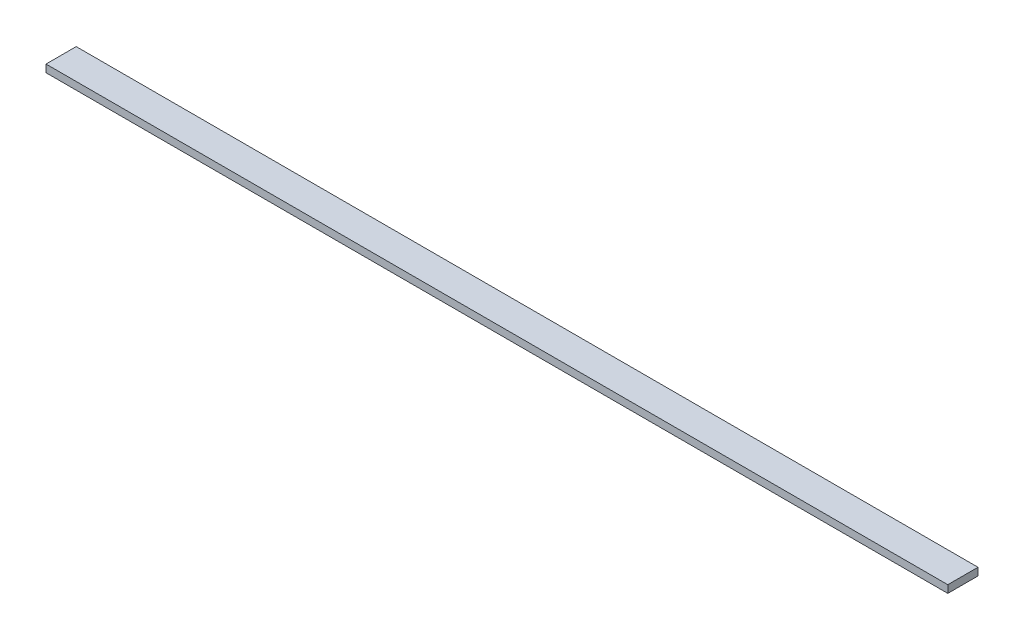
ISO-10303-21;
HEADER;
FILE_DESCRIPTION(('STEP AP214'),'2;1');
FILE_NAME('part.step','',(''),(''),'','','');
FILE_SCHEMA(('AUTOMOTIVE_DESIGN { 1 0 10303 214 1 1 1 1 }'));
ENDSEC;
DATA;
#1=APPLICATION_CONTEXT('core data for automotive mechanical design processes');
#2=APPLICATION_PROTOCOL_DEFINITION('international standard','automotive_design',2000,#1);
#3=PRODUCT_CONTEXT('',#1,'mechanical');
#4=PRODUCT('Part','Part','',(#3));
#5=PRODUCT_RELATED_PRODUCT_CATEGORY('part','',(#4));
#6=PRODUCT_DEFINITION_FORMATION('','',#4);
#7=PRODUCT_DEFINITION_CONTEXT('part definition',#1,'design');
#8=PRODUCT_DEFINITION('design','',#6,#7);
#9=PRODUCT_DEFINITION_SHAPE('','',#8);
#10=(LENGTH_UNIT() NAMED_UNIT(*) SI_UNIT(.MILLI.,.METRE.));
#11=(NAMED_UNIT(*) PLANE_ANGLE_UNIT() SI_UNIT($,.RADIAN.));
#12=(NAMED_UNIT(*) SI_UNIT($,.STERADIAN.) SOLID_ANGLE_UNIT());
#13=UNCERTAINTY_MEASURE_WITH_UNIT(LENGTH_MEASURE(1.E-05),#10,'distance_accuracy_value','');
#14=(GEOMETRIC_REPRESENTATION_CONTEXT(3) GLOBAL_UNCERTAINTY_ASSIGNED_CONTEXT((#13)) GLOBAL_UNIT_ASSIGNED_CONTEXT((#10,
#11,#12)) REPRESENTATION_CONTEXT('',''));
#15=CARTESIAN_POINT('',(0.,0.,0.));
#16=DIRECTION('',(0.,0.,1.));
#17=DIRECTION('',(1.,0.,0.));
#18=AXIS2_PLACEMENT_3D('',#15,#16,#17);
#19=CARTESIAN_POINT('',(284.375,-2.38125,-9.525));
#20=DIRECTION('',(0.,0.,1.));
#21=DIRECTION('',(1.,0.,0.));
#22=AXIS2_PLACEMENT_3D('',#19,#20,#21);
#23=PLANE('',#22);
#24=DIRECTION('',(0.,1.,0.));
#25=VECTOR('',#24,1.);
#26=CARTESIAN_POINT('',(-284.375,-2.38125,-9.525));
#27=LINE('',#26,#25);
#28=CARTESIAN_POINT('',(-284.375,-2.38125,-9.525));
#29=VERTEX_POINT('',#28);
#30=CARTESIAN_POINT('',(-284.375,2.38125,-9.525));
#31=VERTEX_POINT('',#30);
#32=EDGE_CURVE('E102',#29,#31,#27,.T.);
#33=ORIENTED_EDGE('',*,*,#32,.T.);
#34=DIRECTION('',(-1.,0.,0.));
#35=VECTOR('',#34,1.);
#36=CARTESIAN_POINT('',(284.375,2.38125,-9.525));
#37=LINE('',#36,#35);
#38=CARTESIAN_POINT('',(284.375,2.38125,-9.525));
#39=VERTEX_POINT('',#38);
#40=EDGE_CURVE('E11',#39,#31,#37,.T.);
#41=ORIENTED_EDGE('',*,*,#40,.F.);
#42=DIRECTION('',(0.,1.,0.));
#43=VECTOR('',#42,1.);
#44=CARTESIAN_POINT('',(284.375,-2.38125,-9.525));
#45=LINE('',#44,#43);
#46=CARTESIAN_POINT('',(284.375,-2.38125,-9.525));
#47=VERTEX_POINT('',#46);
#48=EDGE_CURVE('E90',#47,#39,#45,.T.);
#49=ORIENTED_EDGE('',*,*,#48,.F.);
#50=DIRECTION('',(-1.,0.,0.));
#51=VECTOR('',#50,1.);
#52=CARTESIAN_POINT('',(284.375,-2.38125,-9.525));
#53=LINE('',#52,#51);
#54=EDGE_CURVE('E98',#47,#29,#53,.T.);
#55=ORIENTED_EDGE('',*,*,#54,.T.);
#56=EDGE_LOOP('',(#33,#41,#49,#55));
#57=FACE_BOUND('',#56,.T.);
#58=ADVANCED_FACE('F39',(#57),#23,.F.);
#59=CARTESIAN_POINT('',(284.375,2.38125,9.525));
#60=DIRECTION('',(0.,-1.,0.));
#61=DIRECTION('',(0.,0.,-1.));
#62=AXIS2_PLACEMENT_3D('',#59,#60,#61);
#63=PLANE('',#62);
#64=DIRECTION('',(0.,0.,1.));
#65=VECTOR('',#64,1.);
#66=CARTESIAN_POINT('',(-284.375,2.38125,9.525));
#67=LINE('',#66,#65);
#68=CARTESIAN_POINT('',(-284.375,2.38125,9.525));
#69=VERTEX_POINT('',#68);
#70=EDGE_CURVE('E94',#31,#69,#67,.T.);
#71=ORIENTED_EDGE('',*,*,#70,.T.);
#72=DIRECTION('',(-1.,0.,0.));
#73=VECTOR('',#72,1.);
#74=CARTESIAN_POINT('',(284.375,2.38125,9.525));
#75=LINE('',#74,#73);
#76=CARTESIAN_POINT('',(284.375,2.38125,9.525));
#77=VERTEX_POINT('',#76);
#78=EDGE_CURVE('E47',#77,#69,#75,.T.);
#79=ORIENTED_EDGE('',*,*,#78,.F.);
#80=DIRECTION('',(0.,0.,1.));
#81=VECTOR('',#80,1.);
#82=CARTESIAN_POINT('',(284.375,2.38125,9.525));
#83=LINE('',#82,#81);
#84=EDGE_CURVE('E85',#39,#77,#83,.T.);
#85=ORIENTED_EDGE('',*,*,#84,.F.);
#86=ORIENTED_EDGE('',*,*,#40,.T.);
#87=EDGE_LOOP('',(#71,#79,#85,#86));
#88=FACE_BOUND('',#87,.T.);
#89=ADVANCED_FACE('F93',(#88),#63,.F.);
#90=CARTESIAN_POINT('',(284.375,-2.38125,9.525));
#91=DIRECTION('',(0.,0.,-1.));
#92=DIRECTION('',(-1.,0.,0.));
#93=AXIS2_PLACEMENT_3D('',#90,#91,#92);
#94=PLANE('',#93);
#95=DIRECTION('',(0.,-1.,0.));
#96=VECTOR('',#95,1.);
#97=CARTESIAN_POINT('',(-284.375,-2.38125,9.525));
#98=LINE('',#97,#96);
#99=CARTESIAN_POINT('',(-284.375,-2.38125,9.525));
#100=VERTEX_POINT('',#99);
#101=EDGE_CURVE('E72',#69,#100,#98,.T.);
#102=ORIENTED_EDGE('',*,*,#101,.T.);
#103=DIRECTION('',(-1.,0.,0.));
#104=VECTOR('',#103,1.);
#105=CARTESIAN_POINT('',(284.375,-2.38125,9.525));
#106=LINE('',#105,#104);
#107=CARTESIAN_POINT('',(284.375,-2.38125,9.525));
#108=VERTEX_POINT('',#107);
#109=EDGE_CURVE('E95',#108,#100,#106,.T.);
#110=ORIENTED_EDGE('',*,*,#109,.F.);
#111=DIRECTION('',(0.,-1.,0.));
#112=VECTOR('',#111,1.);
#113=CARTESIAN_POINT('',(284.375,-2.38125,9.525));
#114=LINE('',#113,#112);
#115=EDGE_CURVE('E88',#77,#108,#114,.T.);
#116=ORIENTED_EDGE('',*,*,#115,.F.);
#117=ORIENTED_EDGE('',*,*,#78,.T.);
#118=EDGE_LOOP('',(#102,#110,#116,#117));
#119=FACE_BOUND('',#118,.T.);
#120=ADVANCED_FACE('F96',(#119),#94,.F.);
#121=CARTESIAN_POINT('',(284.375,-2.38125,9.525));
#122=DIRECTION('',(0.,1.,0.));
#123=DIRECTION('',(0.,0.,1.));
#124=AXIS2_PLACEMENT_3D('',#121,#122,#123);
#125=PLANE('',#124);
#126=DIRECTION('',(0.,0.,-1.));
#127=VECTOR('',#126,1.);
#128=CARTESIAN_POINT('',(-284.375,-2.38125,9.525));
#129=LINE('',#128,#127);
#130=EDGE_CURVE('E78',#100,#29,#129,.T.);
#131=ORIENTED_EDGE('',*,*,#130,.T.);
#132=ORIENTED_EDGE('',*,*,#54,.F.);
#133=DIRECTION('',(0.,0.,-1.));
#134=VECTOR('',#133,1.);
#135=CARTESIAN_POINT('',(284.375,-2.38125,9.525));
#136=LINE('',#135,#134);
#137=EDGE_CURVE('E55',#108,#47,#136,.T.);
#138=ORIENTED_EDGE('',*,*,#137,.F.);
#139=ORIENTED_EDGE('',*,*,#109,.T.);
#140=EDGE_LOOP('',(#131,#132,#138,#139));
#141=FACE_BOUND('',#140,.T.);
#142=ADVANCED_FACE('F109',(#141),#125,.F.);
#143=CARTESIAN_POINT('',(284.375,0.,0.));
#144=DIRECTION('',(-1.,0.,0.));
#145=DIRECTION('',(0.,0.,1.));
#146=AXIS2_PLACEMENT_3D('',#143,#144,#145);
#147=PLANE('',#146);
#148=ORIENTED_EDGE('',*,*,#48,.T.);
#149=ORIENTED_EDGE('',*,*,#84,.T.);
#150=ORIENTED_EDGE('',*,*,#115,.T.);
#151=ORIENTED_EDGE('',*,*,#137,.T.);
#152=EDGE_LOOP('',(#148,#149,#150,#151));
#153=FACE_BOUND('',#152,.T.);
#154=ADVANCED_FACE('F86',(#153),#147,.F.);
#155=CARTESIAN_POINT('',(-284.375,0.,0.));
#156=DIRECTION('',(-1.,0.,0.));
#157=DIRECTION('',(0.,0.,1.));
#158=AXIS2_PLACEMENT_3D('',#155,#156,#157);
#159=PLANE('',#158);
#160=ORIENTED_EDGE('',*,*,#32,.F.);
#161=ORIENTED_EDGE('',*,*,#130,.F.);
#162=ORIENTED_EDGE('',*,*,#101,.F.);
#163=ORIENTED_EDGE('',*,*,#70,.F.);
#164=EDGE_LOOP('',(#160,#161,#162,#163));
#165=FACE_BOUND('',#164,.T.);
#166=ADVANCED_FACE('F112',(#165),#159,.T.);
#167=CLOSED_SHELL('',(#58,#89,#120,#142,#154,#166));
#168=MANIFOLD_SOLID_BREP('B2',#167);
#169=ADVANCED_BREP_SHAPE_REPRESENTATION('',(#18,#168),#14);
#170=SHAPE_DEFINITION_REPRESENTATION(#9,#169);
ENDSEC;
END-ISO-10303-21;
